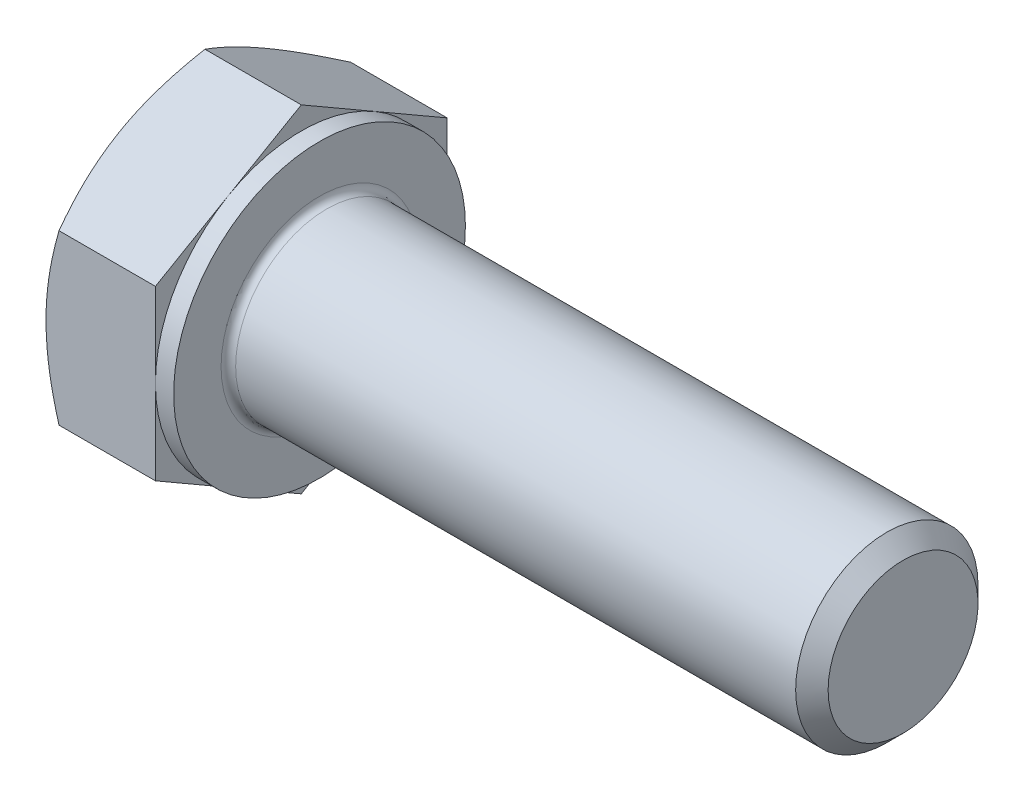
ISO-10303-21;
HEADER;
FILE_DESCRIPTION(('STEP AP214'),'2;1');
FILE_NAME('part.step','',(''),(''),'','','');
FILE_SCHEMA(('AUTOMOTIVE_DESIGN { 1 0 10303 214 1 1 1 1 }'));
ENDSEC;
DATA;
#1=APPLICATION_CONTEXT('core data for automotive mechanical design processes');
#2=APPLICATION_PROTOCOL_DEFINITION('international standard','automotive_design',2000,#1);
#3=PRODUCT_CONTEXT('',#1,'mechanical');
#4=PRODUCT('Part','Part','',(#3));
#5=PRODUCT_RELATED_PRODUCT_CATEGORY('part','',(#4));
#6=PRODUCT_DEFINITION_FORMATION('','',#4);
#7=PRODUCT_DEFINITION_CONTEXT('part definition',#1,'design');
#8=PRODUCT_DEFINITION('design','',#6,#7);
#9=PRODUCT_DEFINITION_SHAPE('','',#8);
#10=(LENGTH_UNIT() NAMED_UNIT(*) SI_UNIT(.MILLI.,.METRE.));
#11=(NAMED_UNIT(*) PLANE_ANGLE_UNIT() SI_UNIT($,.RADIAN.));
#12=(NAMED_UNIT(*) SI_UNIT($,.STERADIAN.) SOLID_ANGLE_UNIT());
#13=UNCERTAINTY_MEASURE_WITH_UNIT(LENGTH_MEASURE(1.E-05),#10,'distance_accuracy_value','');
#14=(GEOMETRIC_REPRESENTATION_CONTEXT(3) GLOBAL_UNCERTAINTY_ASSIGNED_CONTEXT((#13)) GLOBAL_UNIT_ASSIGNED_CONTEXT((#10,
#11,#12)) REPRESENTATION_CONTEXT('',''));
#15=CARTESIAN_POINT('',(0.,0.,0.));
#16=DIRECTION('',(0.,0.,1.));
#17=DIRECTION('',(1.,0.,0.));
#18=AXIS2_PLACEMENT_3D('',#15,#16,#17);
#19=CARTESIAN_POINT('',(-29.5,14.9999999999999,0.));
#20=DIRECTION('',(1.,0.,0.));
#21=DIRECTION('',(0.,0.,-1.));
#22=AXIS2_PLACEMENT_3D('',#19,#20,#21);
#23=CONICAL_SURFACE('',#22,4.,1.0471975511966);
#24=CARTESIAN_POINT('',(-29.1426677409252,10.3810823764291,-0.000200000000000053));
#25=CARTESIAN_POINT('',(-29.2012821263517,10.4825685161861,0.175579150323228));
#26=CARTESIAN_POINT('',(-29.2545896785377,10.5849306785594,0.352875616326381));
#27=CARTESIAN_POINT('',(-29.3476383292536,10.7914274945225,0.710538593175706));
#28=CARTESIAN_POINT('',(-29.3873465109703,10.8955658171435,0.890911458970151));
#29=CARTESIAN_POINT('',(-29.4491577847197,11.1025518698424,1.24942181870279));
#30=CARTESIAN_POINT('',(-29.4716722684771,11.2053677534493,1.42750415293514));
#31=CARTESIAN_POINT('',(-29.4985493768534,11.4114832800097,1.78450671716651));
#32=CARTESIAN_POINT('',(-29.5029342585731,11.5147821738388,1.9634256496441));
#33=CARTESIAN_POINT('',(-29.49380992706,11.7078002949537,2.29774284219673));
#34=CARTESIAN_POINT('',(-29.482541046012,11.7975484230751,2.45319115998706));
#35=CARTESIAN_POINT('',(-29.4468260092018,11.976459973645,2.76307505563505));
#36=CARTESIAN_POINT('',(-29.4223676542885,12.0656227773192,2.91750956174413));
#37=CARTESIAN_POINT('',(-29.3612239350807,12.2449031798764,3.22803232777458));
#38=CARTESIAN_POINT('',(-29.3242793963451,12.3349980891057,3.3840812880631));
#39=CARTESIAN_POINT('',(-29.240429927452,12.5138441979999,3.69385183540384));
#40=CARTESIAN_POINT('',(-29.1935446977873,12.6025976887741,3.84757739077378));
#41=CARTESIAN_POINT('',(-29.1426677409252,12.6907143932953,4.0002));
#42=B_SPLINE_CURVE_WITH_KNOTS('',3,(#24,#25,#26,#27,#28,#29,#30,#31,#32,#33,#34,#35,#36,#37,#38,
#39,#40,#41),.UNSPECIFIED.,.F.,.F.,(4,2,2,2,2,2,2,2,4),(0.,0.634047835695967,1.26961969224543,
1.88946157213122,2.50854226669297,3.04757825393386,3.58711366126904,4.13861653143764,
4.68903648037744),.UNSPECIFIED.);
#43=CARTESIAN_POINT('',(-29.1427344100918,10.3811978464829,0.));
#44=VERTEX_POINT('',#43);
#45=CARTESIAN_POINT('',(-29.5,11.5358983848622,2.00000000000001));
#46=VERTEX_POINT('',#45);
#47=EDGE_CURVE('E107',#44,#46,#42,.T.);
#48=ORIENTED_EDGE('',*,*,#47,.T.);
#49=CARTESIAN_POINT('',(-29.5,14.9999999999999,0.));
#50=DIRECTION('',(1.,0.,0.));
#51=DIRECTION('',(0.,0.,-1.));
#52=AXIS2_PLACEMENT_3D('',#49,#50,#51);
#53=CIRCLE('',#52,4.);
#54=CARTESIAN_POINT('',(-29.5,11.5358983848622,-2.));
#55=VERTEX_POINT('',#54);
#56=EDGE_CURVE('E109',#46,#55,#53,.T.);
#57=ORIENTED_EDGE('',*,*,#56,.T.);
#58=CARTESIAN_POINT('',(-29.1426677409252,12.6907143932953,-4.0002));
#59=CARTESIAN_POINT('',(-29.2012821263517,12.5892282535382,-3.82442084967677));
#60=CARTESIAN_POINT('',(-29.2545896785377,12.4868660911649,-3.64712438367362));
#61=CARTESIAN_POINT('',(-29.3476383292536,12.2803692752018,-3.28946140682429));
#62=CARTESIAN_POINT('',(-29.3873465109703,12.1762309525809,-3.10908854102985));
#63=CARTESIAN_POINT('',(-29.4491577847197,11.969244899882,-2.75057818129721));
#64=CARTESIAN_POINT('',(-29.4716722684771,11.866429016275,-2.57249584706486));
#65=CARTESIAN_POINT('',(-29.4985493768534,11.6603134897146,-2.21549328283349));
#66=CARTESIAN_POINT('',(-29.502934258573,11.5570145958856,-2.0365743503559));
#67=CARTESIAN_POINT('',(-29.49380992706,11.3639964747706,-1.70225715780327));
#68=CARTESIAN_POINT('',(-29.482541046012,11.2742483466493,-1.54680884001293));
#69=CARTESIAN_POINT('',(-29.4468260092018,11.0953367960794,-1.23692494436494));
#70=CARTESIAN_POINT('',(-29.4223676542885,11.0061739924051,-1.08249043825587));
#71=CARTESIAN_POINT('',(-29.3612239350807,10.826893589848,-0.771967672225421));
#72=CARTESIAN_POINT('',(-29.3242793963451,10.7367986806186,-0.615918711936897));
#73=CARTESIAN_POINT('',(-29.240429927452,10.5579525717244,-0.30614816459616));
#74=CARTESIAN_POINT('',(-29.1935446977873,10.4691990809503,-0.15242260922622));
#75=CARTESIAN_POINT('',(-29.1426677409252,10.3810823764291,0.000200000000000096));
#76=B_SPLINE_CURVE_WITH_KNOTS('',3,(#58,#59,#60,#61,#62,#63,#64,#65,#66,#67,#68,#69,#70,#71,#72,
#73,#74,#75),.UNSPECIFIED.,.F.,.F.,(4,2,2,2,2,2,2,2,4),(0.,0.634047835695967,1.26961969224543,
1.88946157213122,2.50854226669297,3.04757825393386,3.58711366126903,4.13861653143764,
4.68903648037743),.UNSPECIFIED.);
#77=EDGE_CURVE('E111',#55,#44,#76,.T.);
#78=ORIENTED_EDGE('',*,*,#77,.T.);
#79=EDGE_LOOP('',(#48,#57,#78));
#80=FACE_BOUND('',#79,.T.);
#81=ADVANCED_FACE('F16',(#80),#23,.T.);
#82=CARTESIAN_POINT('',(-26.,10.3811978464829,0.));
#83=DIRECTION('',(0.,0.866025403784437,-0.500000000000002));
#84=DIRECTION('',(0.,0.500000000000002,0.866025403784438));
#85=AXIS2_PLACEMENT_3D('',#82,#83,#84);
#86=PLANE('',#85);
#87=DIRECTION('',(0.,-0.500000000000002,-0.866025403784438));
#88=VECTOR('',#87,1.);
#89=CARTESIAN_POINT('',(-26.5,10.3811978464829,0.));
#90=LINE('',#89,#88);
#91=CARTESIAN_POINT('',(-26.5,12.6905989232414,4.));
#92=VERTEX_POINT('',#91);
#93=CARTESIAN_POINT('',(-26.5,11.5358983848622,2.00000000000001));
#94=VERTEX_POINT('',#93);
#95=EDGE_CURVE('E343',#92,#94,#90,.T.);
#96=ORIENTED_EDGE('',*,*,#95,.F.);
#97=DIRECTION('',(-1.,0.,0.));
#98=VECTOR('',#97,1.);
#99=CARTESIAN_POINT('',(-26.,12.6905989232414,4.));
#100=LINE('',#99,#98);
#101=CARTESIAN_POINT('',(-29.1427344100918,12.6905989232414,4.));
#102=VERTEX_POINT('',#101);
#103=EDGE_CURVE('E130',#92,#102,#100,.T.);
#104=ORIENTED_EDGE('',*,*,#103,.T.);
#105=EDGE_CURVE('E116',#46,#102,#42,.T.);
#106=ORIENTED_EDGE('',*,*,#105,.F.);
#107=ORIENTED_EDGE('',*,*,#47,.F.);
#108=DIRECTION('',(-1.,0.,0.));
#109=VECTOR('',#108,1.);
#110=CARTESIAN_POINT('',(-26.,10.3811978464829,0.));
#111=LINE('',#110,#109);
#112=CARTESIAN_POINT('',(-26.5,10.3811978464829,0.));
#113=VERTEX_POINT('',#112);
#114=EDGE_CURVE('E134',#113,#44,#111,.T.);
#115=ORIENTED_EDGE('',*,*,#114,.F.);
#116=EDGE_CURVE('E318',#94,#113,#90,.T.);
#117=ORIENTED_EDGE('',*,*,#116,.F.);
#118=EDGE_LOOP('',(#96,#104,#106,#107,#115,#117));
#119=FACE_BOUND('',#118,.T.);
#120=ADVANCED_FACE('F128',(#119),#86,.F.);
#121=CARTESIAN_POINT('',(-26.5,18.9999999999999,0.));
#122=DIRECTION('',(1.,0.,0.));
#123=DIRECTION('',(0.,0.,-1.));
#124=AXIS2_PLACEMENT_3D('',#121,#122,#123);
#125=PLANE('',#124);
#126=DIRECTION('',(0.,-1.,0.));
#127=VECTOR('',#126,1.);
#128=CARTESIAN_POINT('',(-26.5,17.3094010767584,4.));
#129=LINE('',#128,#127);
#130=CARTESIAN_POINT('',(-26.5,14.9999999999999,4.));
#131=VERTEX_POINT('',#130);
#132=EDGE_CURVE('E341',#131,#92,#129,.T.);
#133=ORIENTED_EDGE('',*,*,#132,.T.);
#134=ORIENTED_EDGE('',*,*,#95,.T.);
#135=CARTESIAN_POINT('',(-26.5,14.9999999999999,0.));
#136=DIRECTION('',(-1.,0.,0.));
#137=DIRECTION('',(0.,0.,1.));
#138=AXIS2_PLACEMENT_3D('',#135,#136,#137);
#139=CIRCLE('',#138,4.);
#140=EDGE_CURVE('E185',#94,#131,#139,.T.);
#141=ORIENTED_EDGE('',*,*,#140,.T.);
#142=EDGE_LOOP('',(#133,#134,#141));
#143=FACE_BOUND('',#142,.T.);
#144=ADVANCED_FACE('F248',(#143),#125,.T.);
#145=CARTESIAN_POINT('',(-26.,17.3094010767584,4.));
#146=DIRECTION('',(0.,0.,-1.));
#147=DIRECTION('',(0.,1.,0.));
#148=AXIS2_PLACEMENT_3D('',#145,#146,#147);
#149=PLANE('',#148);
#150=CARTESIAN_POINT('',(-26.5,17.3094010767584,4.));
#151=VERTEX_POINT('',#150);
#152=EDGE_CURVE('E340',#151,#131,#129,.T.);
#153=ORIENTED_EDGE('',*,*,#152,.F.);
#154=DIRECTION('',(-1.,0.,0.));
#155=VECTOR('',#154,1.);
#156=CARTESIAN_POINT('',(-26.,17.3094010767584,4.));
#157=LINE('',#156,#155);
#158=CARTESIAN_POINT('',(-29.1427344100918,17.3094010767584,4.));
#159=VERTEX_POINT('',#158);
#160=EDGE_CURVE('E339',#151,#159,#157,.T.);
#161=ORIENTED_EDGE('',*,*,#160,.T.);
#162=CARTESIAN_POINT('',(-27.4998887961495,8.69796157658811,4.));
#163=CARTESIAN_POINT('',(-27.5854530369729,8.87354153497209,4.));
#164=CARTESIAN_POINT('',(-27.6702248430965,9.04951414561178,4.));
#165=CARTESIAN_POINT('',(-27.837739723387,9.40245315858413,4.));
#166=CARTESIAN_POINT('',(-27.9204824959664,9.57941970390419,4.));
#167=CARTESIAN_POINT('',(-28.0838907382949,9.93542014962346,4.));
#168=CARTESIAN_POINT('',(-28.1645432739468,10.1144600067295,4.));
#169=CARTESIAN_POINT('',(-28.3226764203452,10.4739298696836,4.));
#170=CARTESIAN_POINT('',(-28.400157174723,10.6543598121421,4.));
#171=CARTESIAN_POINT('',(-28.5536716825981,11.0230428778165,4.));
#172=CARTESIAN_POINT('',(-28.6295672963304,11.2113538254883,4.));
#173=CARTESIAN_POINT('',(-28.7758497847195,11.5901420119287,4.));
#174=CARTESIAN_POINT('',(-28.8462360553385,11.780619485618,4.));
#175=CARTESIAN_POINT('',(-28.9797243769526,12.1637182300872,4.));
#176=CARTESIAN_POINT('',(-29.0428403490089,12.3563346025639,4.));
#177=CARTESIAN_POINT('',(-29.1598284826928,12.7443286575659,4.));
#178=CARTESIAN_POINT('',(-29.2137034525482,12.9397054816194,4.));
#179=CARTESIAN_POINT('',(-29.3094039202655,13.3322498044961,4.));
#180=CARTESIAN_POINT('',(-29.3512969444863,13.5294005391197,4.));
#181=CARTESIAN_POINT('',(-29.4207298053613,13.9262536760577,4.));
#182=CARTESIAN_POINT('',(-29.4482712073208,14.1259557976617,4.));
#183=CARTESIAN_POINT('',(-29.4864482629274,14.5242663068987,4.));
#184=CARTESIAN_POINT('',(-29.4973089342517,14.7228525804078,4.));
#185=CARTESIAN_POINT('',(-29.5018027718821,15.12024143528,4.));
#186=CARTESIAN_POINT('',(-29.4954356907423,15.3190440197091,4.));
#187=CARTESIAN_POINT('',(-29.4706800159784,15.6536491305111,4.));
#188=CARTESIAN_POINT('',(-29.4566512306317,15.7897962038773,4.));
#189=CARTESIAN_POINT('',(-29.4213349416854,16.061151796549,4.));
#190=CARTESIAN_POINT('',(-29.4000465350652,16.1963601969574,4.));
#191=CARTESIAN_POINT('',(-29.3264048874112,16.6003610867596,4.));
#192=CARTESIAN_POINT('',(-29.2642863908954,16.8673965799238,4.));
#193=CARTESIAN_POINT('',(-29.1558120932894,17.2669084207604,4.));
#194=CARTESIAN_POINT('',(-29.1165655166621,17.4014334823697,4.));
#195=CARTESIAN_POINT('',(-29.0338088985023,17.6691784914413,4.));
#196=CARTESIAN_POINT('',(-28.9902988239799,17.8023984287961,4.));
#197=CARTESIAN_POINT('',(-28.8997289068467,18.0675733901942,4.));
#198=CARTESIAN_POINT('',(-28.8526700574738,18.1995287566003,4.));
#199=CARTESIAN_POINT('',(-28.7555749048121,18.4623323384186,4.));
#200=CARTESIAN_POINT('',(-28.7055386705795,18.5931805794286,4.));
#201=CARTESIAN_POINT('',(-28.5666442616633,18.9462730200095,4.));
#202=CARTESIAN_POINT('',(-28.4754012405551,19.1675782346863,4.));
#203=CARTESIAN_POINT('',(-28.2875277167214,19.6078984954444,4.));
#204=CARTESIAN_POINT('',(-28.1908966079767,19.826913280609,4.));
#205=CARTESIAN_POINT('',(-27.9935297345821,20.2631725015547,4.));
#206=CARTESIAN_POINT('',(-27.8927925316548,20.4804162844557,4.));
#207=CARTESIAN_POINT('',(-27.6881887153415,20.9134283158316,4.));
#208=CARTESIAN_POINT('',(-27.5843220049164,21.1291965182972,4.));
#209=CARTESIAN_POINT('',(-27.3739823112541,21.5598802172623,4.));
#210=CARTESIAN_POINT('',(-27.2675054560151,21.7747938188175,4.));
#211=CARTESIAN_POINT('',(-27.0526079641295,22.2036480285313,4.));
#212=CARTESIAN_POINT('',(-26.9441873066838,22.4175886262479,4.));
#213=CARTESIAN_POINT('',(-26.6166549654437,23.0581260332037,4.));
#214=CARTESIAN_POINT('',(-26.3952245067659,23.4835366030032,4.));
#215=CARTESIAN_POINT('',(-25.9720105066474,24.2870483021661,4.));
#216=CARTESIAN_POINT('',(-25.7706420495133,24.6653691275771,4.));
#217=CARTESIAN_POINT('',(-25.365481408379,25.4207405569165,4.));
#218=CARTESIAN_POINT('',(-25.1616890732912,25.7977910797636,4.));
#219=CARTESIAN_POINT('',(-24.7530047448409,26.5496417866801,4.));
#220=CARTESIAN_POINT('',(-24.5481188077559,26.9244452679584,4.));
#221=CARTESIAN_POINT('',(-24.1369734047691,27.6732594596549,4.));
#222=CARTESIAN_POINT('',(-23.9307140499049,28.0472702310148,4.));
#223=CARTESIAN_POINT('',(-23.7239549669649,28.4210028084017,4.));
#224=B_SPLINE_CURVE_WITH_KNOTS('',3,(#162,#163,#164,#165,#166,#167,#168,#169,#170,#171,#172,
#173,#174,#175,#176,#177,#178,#179,#180,#181,#182,#183,#184,#185,#186,#187,#188,#189,#190,#191,
#192,#193,#194,#195,#196,#197,#198,#199,#200,#201,#202,#203,#204,#205,#206,#207,#208,#209,#210,
#211,#212,#213,#214,#215,#216,#217,#218,#219,#220,#221,#222,#223),.UNSPECIFIED.,.F.,.F.,(4,2,2,
2,2,2,2,2,2,2,2,2,2,2,2,2,2,2,2,2,2,2,2,2,2,2,2,2,2,2,4),(0.,0.58596407958923,1.1720147329867,
1.76109183439221,2.35014223039207,2.95916537113302,3.56825519120251,4.17615863495934,
4.78387701573011,5.38809978568041,5.99225664035712,6.58818972380394,7.1841313668092,
7.59453802315343,8.00499574839966,8.82630883348706,9.24666973074844,9.66703388092334,
10.0872808123363,10.5075180005348,11.2255416622244,11.9436462463738,12.6620045660407,
13.3803851833438,14.0999050636407,14.8194326474842,16.2581595478086,17.5438734370163,
18.8296678929703,20.1111105384062,21.3924508103747),.UNSPECIFIED.);
#225=CARTESIAN_POINT('',(-29.5,14.9999999999999,4.));
#226=VERTEX_POINT('',#225);
#227=EDGE_CURVE('E223',#226,#159,#224,.T.);
#228=ORIENTED_EDGE('',*,*,#227,.F.);
#229=EDGE_CURVE('E136',#102,#226,#224,.T.);
#230=ORIENTED_EDGE('',*,*,#229,.F.);
#231=ORIENTED_EDGE('',*,*,#103,.F.);
#232=ORIENTED_EDGE('',*,*,#132,.F.);
#233=EDGE_LOOP('',(#153,#161,#228,#230,#231,#232));
#234=FACE_BOUND('',#233,.T.);
#235=ADVANCED_FACE('F245',(#234),#149,.F.);
#236=DIRECTION('',(0.,-0.500000000000001,0.866025403784438));
#237=VECTOR('',#236,1.);
#238=CARTESIAN_POINT('',(-26.5,19.6188021535169,0.));
#239=LINE('',#238,#237);
#240=CARTESIAN_POINT('',(-26.5,18.4641016151377,2.));
#241=VERTEX_POINT('',#240);
#242=EDGE_CURVE('E335',#241,#151,#239,.T.);
#243=ORIENTED_EDGE('',*,*,#242,.T.);
#244=ORIENTED_EDGE('',*,*,#152,.T.);
#245=EDGE_CURVE('E316',#131,#241,#139,.T.);
#246=ORIENTED_EDGE('',*,*,#245,.T.);
#247=EDGE_LOOP('',(#243,#244,#246));
#248=FACE_BOUND('',#247,.T.);
#249=ADVANCED_FACE('F243',(#248),#125,.T.);
#250=CARTESIAN_POINT('',(-26.,19.6188021535169,0.));
#251=DIRECTION('',(0.,-0.866025403784438,-0.500000000000001));
#252=DIRECTION('',(0.,0.500000000000001,-0.866025403784438));
#253=AXIS2_PLACEMENT_3D('',#250,#251,#252);
#254=PLANE('',#253);
#255=CARTESIAN_POINT('',(-26.5,19.6188021535169,0.));
#256=VERTEX_POINT('',#255);
#257=EDGE_CURVE('E334',#256,#241,#239,.T.);
#258=ORIENTED_EDGE('',*,*,#257,.F.);
#259=DIRECTION('',(-1.,0.,0.));
#260=VECTOR('',#259,1.);
#261=CARTESIAN_POINT('',(-26.,19.6188021535169,0.));
#262=LINE('',#261,#260);
#263=CARTESIAN_POINT('',(-29.1427344100918,19.6188021535169,0.));
#264=VERTEX_POINT('',#263);
#265=EDGE_CURVE('E237',#256,#264,#262,.T.);
#266=ORIENTED_EDGE('',*,*,#265,.T.);
#267=CARTESIAN_POINT('',(-29.1426677409252,17.3092856067046,4.0002));
#268=CARTESIAN_POINT('',(-29.2012821263517,17.4107717464616,3.82442084967677));
#269=CARTESIAN_POINT('',(-29.2545896785377,17.5131339088349,3.64712438367362));
#270=CARTESIAN_POINT('',(-29.3476383292536,17.719630724798,3.28946140682429));
#271=CARTESIAN_POINT('',(-29.3873465109703,17.823769047419,3.10908854102985));
#272=CARTESIAN_POINT('',(-29.4491577847197,18.0307551001179,2.75057818129721));
#273=CARTESIAN_POINT('',(-29.4716722684771,18.1335709837248,2.57249584706486));
#274=CARTESIAN_POINT('',(-29.4985493768534,18.3396865102852,2.21549328283349));
#275=CARTESIAN_POINT('',(-29.5029342585731,18.4429854041143,2.0365743503559));
#276=CARTESIAN_POINT('',(-29.49380992706,18.6360035252293,1.70225715780327));
#277=CARTESIAN_POINT('',(-29.482541046012,18.7257516533506,1.54680884001294));
#278=CARTESIAN_POINT('',(-29.4468260092018,18.9046632039205,1.23692494436495));
#279=CARTESIAN_POINT('',(-29.4223676542885,18.9938260075947,1.08249043825587));
#280=CARTESIAN_POINT('',(-29.3612239350807,19.1731064101519,0.771967672225423));
#281=CARTESIAN_POINT('',(-29.3242793963451,19.2632013193812,0.615918711936898));
#282=CARTESIAN_POINT('',(-29.240429927452,19.4420474282754,0.30614816459616));
#283=CARTESIAN_POINT('',(-29.1935446977873,19.5308009190496,0.15242260922622));
#284=CARTESIAN_POINT('',(-29.1426677409252,19.6189176235708,-0.000200000000000094));
#285=B_SPLINE_CURVE_WITH_KNOTS('',3,(#267,#268,#269,#270,#271,#272,#273,#274,#275,#276,#277,
#278,#279,#280,#281,#282,#283,#284),.UNSPECIFIED.,.F.,.F.,(4,2,2,2,2,2,2,2,4),(0.,
0.634047835695966,1.26961969224543,1.88946157213122,2.50854226669297,3.04757825393385,
3.58711366126903,4.13861653143764,4.68903648037743),.UNSPECIFIED.);
#286=CARTESIAN_POINT('',(-29.5,18.4641016151377,2.));
#287=VERTEX_POINT('',#286);
#288=EDGE_CURVE('E231',#287,#264,#285,.T.);
#289=ORIENTED_EDGE('',*,*,#288,.F.);
#290=EDGE_CURVE('E236',#159,#287,#285,.T.);
#291=ORIENTED_EDGE('',*,*,#290,.F.);
#292=ORIENTED_EDGE('',*,*,#160,.F.);
#293=ORIENTED_EDGE('',*,*,#242,.F.);
#294=EDGE_LOOP('',(#258,#266,#289,#291,#292,#293));
#295=FACE_BOUND('',#294,.T.);
#296=ADVANCED_FACE('F239',(#295),#254,.F.);
#297=DIRECTION('',(0.,0.500000000000001,0.866025403784438));
#298=VECTOR('',#297,1.);
#299=CARTESIAN_POINT('',(-26.5,17.3094010767584,-4.));
#300=LINE('',#299,#298);
#301=CARTESIAN_POINT('',(-26.5,18.4641016151377,-2.));
#302=VERTEX_POINT('',#301);
#303=EDGE_CURVE('E238',#302,#256,#300,.T.);
#304=ORIENTED_EDGE('',*,*,#303,.T.);
#305=ORIENTED_EDGE('',*,*,#257,.T.);
#306=EDGE_CURVE('E311',#241,#302,#139,.T.);
#307=ORIENTED_EDGE('',*,*,#306,.T.);
#308=EDGE_LOOP('',(#304,#305,#307));
#309=FACE_BOUND('',#308,.T.);
#310=ADVANCED_FACE('F242',(#309),#125,.T.);
#311=CARTESIAN_POINT('',(-26.,17.3094010767584,-4.));
#312=DIRECTION('',(0.,-0.866025403784438,0.500000000000001));
#313=DIRECTION('',(0.,-0.500000000000001,-0.866025403784438));
#314=AXIS2_PLACEMENT_3D('',#311,#312,#313);
#315=PLANE('',#314);
#316=CARTESIAN_POINT('',(-26.5,17.3094010767584,-4.));
#317=VERTEX_POINT('',#316);
#318=EDGE_CURVE('E315',#317,#302,#300,.T.);
#319=ORIENTED_EDGE('',*,*,#318,.F.);
#320=DIRECTION('',(-1.,0.,0.));
#321=VECTOR('',#320,1.);
#322=CARTESIAN_POINT('',(-26.,17.3094010767584,-4.));
#323=LINE('',#322,#321);
#324=CARTESIAN_POINT('',(-29.1427344100918,17.3094010767584,-4.));
#325=VERTEX_POINT('',#324);
#326=EDGE_CURVE('E196',#317,#325,#323,.T.);
#327=ORIENTED_EDGE('',*,*,#326,.T.);
#328=CARTESIAN_POINT('',(-29.1426677409252,19.6189176235708,0.0002));
#329=CARTESIAN_POINT('',(-29.2012821263517,19.5174314838137,-0.175579150323228));
#330=CARTESIAN_POINT('',(-29.2545896785377,19.4150693214404,-0.35287561632638));
#331=CARTESIAN_POINT('',(-29.3476383292536,19.2085725054773,-0.710538593175705));
#332=CARTESIAN_POINT('',(-29.3873465109703,19.1044341828564,-0.890911458970149));
#333=CARTESIAN_POINT('',(-29.4491577847197,18.8974481301575,-1.24942181870279));
#334=CARTESIAN_POINT('',(-29.4716722684771,18.7946322465505,-1.42750415293514));
#335=CARTESIAN_POINT('',(-29.4985493768534,18.5885167199902,-1.78450671716651));
#336=CARTESIAN_POINT('',(-29.5029342585731,18.4852178261611,-1.9634256496441));
#337=CARTESIAN_POINT('',(-29.49380992706,18.2921997050461,-2.29774284219673));
#338=CARTESIAN_POINT('',(-29.482541046012,18.2024515769248,-2.45319115998706));
#339=CARTESIAN_POINT('',(-29.4468260092018,18.0235400263549,-2.76307505563505));
#340=CARTESIAN_POINT('',(-29.4223676542885,17.9343772226806,-2.91750956174413));
#341=CARTESIAN_POINT('',(-29.3612239350807,17.7550968201235,-3.22803232777458));
#342=CARTESIAN_POINT('',(-29.3242793963451,17.6650019108941,-3.3840812880631));
#343=CARTESIAN_POINT('',(-29.240429927452,17.4861558019999,-3.69385183540384));
#344=CARTESIAN_POINT('',(-29.1935446977873,17.3974023112258,-3.84757739077378));
#345=CARTESIAN_POINT('',(-29.1426677409252,17.3092856067046,-4.0002));
#346=B_SPLINE_CURVE_WITH_KNOTS('',3,(#328,#329,#330,#331,#332,#333,#334,#335,#336,#337,#338,
#339,#340,#341,#342,#343,#344,#345),.UNSPECIFIED.,.F.,.F.,(4,2,2,2,2,2,2,2,4),(0.,
0.634047835695967,1.26961969224543,1.88946157213122,2.50854226669297,3.04757825393386,
3.58711366126904,4.13861653143764,4.68903648037744),.UNSPECIFIED.);
#347=CARTESIAN_POINT('',(-29.5,18.4641016151377,-2.));
#348=VERTEX_POINT('',#347);
#349=EDGE_CURVE('E189',#348,#325,#346,.T.);
#350=ORIENTED_EDGE('',*,*,#349,.F.);
#351=EDGE_CURVE('E195',#264,#348,#346,.T.);
#352=ORIENTED_EDGE('',*,*,#351,.F.);
#353=ORIENTED_EDGE('',*,*,#265,.F.);
#354=ORIENTED_EDGE('',*,*,#303,.F.);
#355=EDGE_LOOP('',(#319,#327,#350,#352,#353,#354));
#356=FACE_BOUND('',#355,.T.);
#357=ADVANCED_FACE('F198',(#356),#315,.F.);
#358=ORIENTED_EDGE('',*,*,#318,.T.);
#359=CARTESIAN_POINT('',(-26.5,14.9999999999999,-4.));
#360=VERTEX_POINT('',#359);
#361=EDGE_CURVE('E188',#302,#360,#139,.T.);
#362=ORIENTED_EDGE('',*,*,#361,.T.);
#363=DIRECTION('',(0.,1.,0.));
#364=VECTOR('',#363,1.);
#365=CARTESIAN_POINT('',(-26.5,17.3094010767584,-4.));
#366=LINE('',#365,#364);
#367=EDGE_CURVE('E158',#360,#317,#366,.T.);
#368=ORIENTED_EDGE('',*,*,#367,.T.);
#369=EDGE_LOOP('',(#358,#362,#368));
#370=FACE_BOUND('',#369,.T.);
#371=ADVANCED_FACE('F298',(#370),#125,.T.);
#372=CARTESIAN_POINT('',(-29.5,14.9999999999999,0.));
#373=DIRECTION('',(-1.,0.,0.));
#374=DIRECTION('',(0.,0.,1.));
#375=AXIS2_PLACEMENT_3D('',#372,#373,#374);
#376=CYLINDRICAL_SURFACE('',#375,4.);
#377=ORIENTED_EDGE('',*,*,#361,.F.);
#378=ORIENTED_EDGE('',*,*,#306,.F.);
#379=ORIENTED_EDGE('',*,*,#245,.F.);
#380=ORIENTED_EDGE('',*,*,#140,.F.);
#381=CARTESIAN_POINT('',(-26.5,11.5358983848622,-2.));
#382=VERTEX_POINT('',#381);
#383=EDGE_CURVE('E183',#382,#94,#139,.T.);
#384=ORIENTED_EDGE('',*,*,#383,.F.);
#385=EDGE_CURVE('E180',#360,#382,#139,.T.);
#386=ORIENTED_EDGE('',*,*,#385,.F.);
#387=EDGE_LOOP('',(#377,#378,#379,#380,#384,#386));
#388=FACE_BOUND('',#387,.T.);
#389=CARTESIAN_POINT('',(-26.,14.9999999999999,0.));
#390=DIRECTION('',(1.,0.,0.));
#391=DIRECTION('',(0.,0.,-1.));
#392=AXIS2_PLACEMENT_3D('',#389,#390,#391);
#393=CIRCLE('',#392,4.);
#394=CARTESIAN_POINT('',(-26.,14.9999999999999,-4.));
#395=VERTEX_POINT('',#394);
#396=EDGE_CURVE('E174',#395,#395,#393,.T.);
#397=ORIENTED_EDGE('',*,*,#396,.F.);
#398=EDGE_LOOP('',(#397));
#399=FACE_BOUND('',#398,.T.);
#400=ADVANCED_FACE('F296',(#388,#399),#376,.T.);
#401=ORIENTED_EDGE('',*,*,#116,.T.);
#402=DIRECTION('',(0.,0.5,-0.866025403784439));
#403=VECTOR('',#402,1.);
#404=CARTESIAN_POINT('',(-26.5,12.6905989232414,-4.));
#405=LINE('',#404,#403);
#406=EDGE_CURVE('E167',#113,#382,#405,.T.);
#407=ORIENTED_EDGE('',*,*,#406,.T.);
#408=ORIENTED_EDGE('',*,*,#383,.T.);
#409=EDGE_LOOP('',(#401,#407,#408));
#410=FACE_BOUND('',#409,.T.);
#411=ADVANCED_FACE('F260',(#410),#125,.T.);
#412=CARTESIAN_POINT('',(-26.,12.6905989232414,-4.));
#413=DIRECTION('',(0.,0.866025403784439,0.5));
#414=DIRECTION('',(0.,-0.5,0.866025403784439));
#415=AXIS2_PLACEMENT_3D('',#412,#413,#414);
#416=PLANE('',#415);
#417=ORIENTED_EDGE('',*,*,#406,.F.);
#418=ORIENTED_EDGE('',*,*,#114,.T.);
#419=ORIENTED_EDGE('',*,*,#77,.F.);
#420=CARTESIAN_POINT('',(-29.142734410092,12.6905989232412,-4.));
#421=VERTEX_POINT('',#420);
#422=EDGE_CURVE('E171',#421,#55,#76,.T.);
#423=ORIENTED_EDGE('',*,*,#422,.F.);
#424=DIRECTION('',(-1.,0.,0.));
#425=VECTOR('',#424,1.);
#426=CARTESIAN_POINT('',(-26.,12.6905989232414,-4.));
#427=LINE('',#426,#425);
#428=CARTESIAN_POINT('',(-26.5,12.6905989232414,-4.));
#429=VERTEX_POINT('',#428);
#430=EDGE_CURVE('E39',#429,#421,#427,.T.);
#431=ORIENTED_EDGE('',*,*,#430,.F.);
#432=EDGE_CURVE('E165',#382,#429,#405,.T.);
#433=ORIENTED_EDGE('',*,*,#432,.F.);
#434=EDGE_LOOP('',(#417,#418,#419,#423,#431,#433));
#435=FACE_BOUND('',#434,.T.);
#436=ADVANCED_FACE('F293',(#435),#416,.F.);
#437=ORIENTED_EDGE('',*,*,#422,.T.);
#438=CARTESIAN_POINT('',(-29.5,14.9999999999999,-4.));
#439=VERTEX_POINT('',#438);
#440=EDGE_CURVE('E31',#55,#439,#53,.T.);
#441=ORIENTED_EDGE('',*,*,#440,.T.);
#442=CARTESIAN_POINT('',(-27.4998887961495,8.6979615765881,-4.));
#443=CARTESIAN_POINT('',(-27.5854530369729,8.87354153497207,-4.));
#444=CARTESIAN_POINT('',(-27.6702248430965,9.04951414561176,-4.));
#445=CARTESIAN_POINT('',(-27.837739723387,9.40245315858411,-4.));
#446=CARTESIAN_POINT('',(-27.9204824959664,9.57941970390418,-4.));
#447=CARTESIAN_POINT('',(-28.0838907382949,9.93542014962344,-4.));
#448=CARTESIAN_POINT('',(-28.1645432739468,10.1144600067295,-4.));
#449=CARTESIAN_POINT('',(-28.3226764203452,10.4739298696835,-4.));
#450=CARTESIAN_POINT('',(-28.400157174723,10.6543598121421,-4.));
#451=CARTESIAN_POINT('',(-28.5536716825981,11.0230428778165,-4.));
#452=CARTESIAN_POINT('',(-28.6295672963304,11.2113538254883,-4.));
#453=CARTESIAN_POINT('',(-28.7758497847195,11.5901420119287,-4.));
#454=CARTESIAN_POINT('',(-28.8462360553384,11.780619485618,-4.));
#455=CARTESIAN_POINT('',(-28.9797243769526,12.1637182300872,-4.));
#456=CARTESIAN_POINT('',(-29.0428403490089,12.3563346025639,-4.));
#457=CARTESIAN_POINT('',(-29.1598284826928,12.7443286575659,-4.));
#458=CARTESIAN_POINT('',(-29.2137034525482,12.9397054816194,-4.));
#459=CARTESIAN_POINT('',(-29.3094039202655,13.3322498044961,-4.));
#460=CARTESIAN_POINT('',(-29.3512969444863,13.5294005391197,-4.));
#461=CARTESIAN_POINT('',(-29.4207298053613,13.9262536760577,-4.));
#462=CARTESIAN_POINT('',(-29.4482712073208,14.1259557976617,-4.));
#463=CARTESIAN_POINT('',(-29.4864482629274,14.5242663068986,-4.));
#464=CARTESIAN_POINT('',(-29.4973089342517,14.7228525804077,-4.));
#465=CARTESIAN_POINT('',(-29.5018027718821,15.12024143528,-4.));
#466=CARTESIAN_POINT('',(-29.4954356907423,15.3190440197091,-4.));
#467=CARTESIAN_POINT('',(-29.4706800159784,15.6536491305111,-4.));
#468=CARTESIAN_POINT('',(-29.4566512306317,15.7897962038773,-4.));
#469=CARTESIAN_POINT('',(-29.4213349416854,16.0611517965489,-4.));
#470=CARTESIAN_POINT('',(-29.4000465350652,16.1963601969574,-4.));
#471=CARTESIAN_POINT('',(-29.3264048874112,16.6003610867596,-4.));
#472=CARTESIAN_POINT('',(-29.2642863908954,16.8673965799238,-4.));
#473=CARTESIAN_POINT('',(-29.1558120932894,17.2669084207604,-4.));
#474=CARTESIAN_POINT('',(-29.1165655166621,17.4014334823697,-4.));
#475=CARTESIAN_POINT('',(-29.0338088985023,17.6691784914413,-4.));
#476=CARTESIAN_POINT('',(-28.9902988239799,17.8023984287961,-4.));
#477=CARTESIAN_POINT('',(-28.8997289068467,18.0675733901942,-4.));
#478=CARTESIAN_POINT('',(-28.8526700574738,18.1995287566003,-4.));
#479=CARTESIAN_POINT('',(-28.7555749048121,18.4623323384186,-4.));
#480=CARTESIAN_POINT('',(-28.7055386705795,18.5931805794286,-4.));
#481=CARTESIAN_POINT('',(-28.5666442616633,18.9462730200094,-4.));
#482=CARTESIAN_POINT('',(-28.4754012405551,19.1675782346863,-4.));
#483=CARTESIAN_POINT('',(-28.2875277167214,19.6078984954444,-4.));
#484=CARTESIAN_POINT('',(-28.1908966079767,19.8269132806089,-4.));
#485=CARTESIAN_POINT('',(-27.9935297345821,20.2631725015547,-4.));
#486=CARTESIAN_POINT('',(-27.8927925316548,20.4804162844556,-4.));
#487=CARTESIAN_POINT('',(-27.6881887153415,20.9134283158316,-4.));
#488=CARTESIAN_POINT('',(-27.5843220049164,21.1291965182972,-4.));
#489=CARTESIAN_POINT('',(-27.3739823112541,21.5598802172623,-4.));
#490=CARTESIAN_POINT('',(-27.2675054560151,21.7747938188175,-4.));
#491=CARTESIAN_POINT('',(-27.0526079641295,22.2036480285313,-4.));
#492=CARTESIAN_POINT('',(-26.9441873066839,22.4175886262479,-4.));
#493=CARTESIAN_POINT('',(-26.6166549654437,23.0581260332037,-4.));
#494=CARTESIAN_POINT('',(-26.3952245067659,23.4835366030032,-4.));
#495=CARTESIAN_POINT('',(-25.9720105066474,24.2870483021661,-4.));
#496=CARTESIAN_POINT('',(-25.7706420495133,24.665369127577,-4.));
#497=CARTESIAN_POINT('',(-25.365481408379,25.4207405569165,-4.));
#498=CARTESIAN_POINT('',(-25.1616890732912,25.7977910797636,-4.));
#499=CARTESIAN_POINT('',(-24.7530047448409,26.5496417866801,-4.));
#500=CARTESIAN_POINT('',(-24.5481188077559,26.9244452679584,-4.));
#501=CARTESIAN_POINT('',(-24.1369734047691,27.6732594596549,-4.));
#502=CARTESIAN_POINT('',(-23.9307140499049,28.0472702310148,-4.));
#503=CARTESIAN_POINT('',(-23.7239549669649,28.4210028084017,-4.));
#504=B_SPLINE_CURVE_WITH_KNOTS('',3,(#442,#443,#444,#445,#446,#447,#448,#449,#450,#451,#452,
#453,#454,#455,#456,#457,#458,#459,#460,#461,#462,#463,#464,#465,#466,#467,#468,#469,#470,#471,
#472,#473,#474,#475,#476,#477,#478,#479,#480,#481,#482,#483,#484,#485,#486,#487,#488,#489,#490,
#491,#492,#493,#494,#495,#496,#497,#498,#499,#500,#501,#502,#503),.UNSPECIFIED.,.F.,.F.,(4,2,2,
2,2,2,2,2,2,2,2,2,2,2,2,2,2,2,2,2,2,2,2,2,2,2,2,2,2,2,4),(0.,0.585964079589232,1.1720147329867,
1.76109183439221,2.35014223039207,2.95916537113302,3.56825519120251,4.17615863495934,
4.78387701573012,5.38809978568042,5.99225664035712,6.58818972380395,7.1841313668092,
7.59453802315344,8.00499574839967,8.82630883348707,9.24666973074844,9.66703388092333,
10.0872808123363,10.5075180005348,11.2255416622244,11.9436462463738,12.6620045660407,
13.3803851833438,14.0999050636407,14.8194326474842,16.2581595478086,17.5438734370163,
18.8296678929704,20.1111105384062,21.3924508103747),.UNSPECIFIED.);
#505=EDGE_CURVE('E141',#439,#421,#504,.F.);
#506=ORIENTED_EDGE('',*,*,#505,.T.);
#507=EDGE_LOOP('',(#437,#441,#506));
#508=FACE_BOUND('',#507,.T.);
#509=ADVANCED_FACE('F206',(#508),#23,.T.);
#510=CARTESIAN_POINT('',(-29.5,19.6188021535169,0.));
#511=DIRECTION('',(1.,0.,0.));
#512=DIRECTION('',(0.,0.,-1.));
#513=AXIS2_PLACEMENT_3D('',#510,#511,#512);
#514=PLANE('',#513);
#515=EDGE_CURVE('E138',#439,#348,#53,.T.);
#516=ORIENTED_EDGE('',*,*,#515,.F.);
#517=ORIENTED_EDGE('',*,*,#440,.F.);
#518=ORIENTED_EDGE('',*,*,#56,.F.);
#519=EDGE_CURVE('E123',#226,#46,#53,.T.);
#520=ORIENTED_EDGE('',*,*,#519,.F.);
#521=CARTESIAN_POINT('',(-29.5,14.9999999999999,0.));
#522=DIRECTION('',(-1.,0.,0.));
#523=DIRECTION('',(0.,0.,1.));
#524=AXIS2_PLACEMENT_3D('',#521,#522,#523);
#525=CIRCLE('',#524,4.);
#526=EDGE_CURVE('E137',#226,#287,#525,.T.);
#527=ORIENTED_EDGE('',*,*,#526,.T.);
#528=EDGE_CURVE('E126',#348,#287,#53,.T.);
#529=ORIENTED_EDGE('',*,*,#528,.F.);
#530=EDGE_LOOP('',(#516,#517,#518,#520,#527,#529));
#531=FACE_BOUND('',#530,.T.);
#532=ADVANCED_FACE('F120',(#531),#514,.F.);
#533=ORIENTED_EDGE('',*,*,#349,.T.);
#534=EDGE_CURVE('E144',#325,#439,#504,.F.);
#535=ORIENTED_EDGE('',*,*,#534,.T.);
#536=ORIENTED_EDGE('',*,*,#515,.T.);
#537=EDGE_LOOP('',(#533,#535,#536));
#538=FACE_BOUND('',#537,.T.);
#539=ADVANCED_FACE('F290',(#538),#23,.T.);
#540=CARTESIAN_POINT('',(-26.,17.3094010767584,-4.));
#541=DIRECTION('',(0.,0.,1.));
#542=DIRECTION('',(1.,0.,0.));
#543=AXIS2_PLACEMENT_3D('',#540,#541,#542);
#544=PLANE('',#543);
#545=EDGE_CURVE('E150',#429,#360,#366,.T.);
#546=ORIENTED_EDGE('',*,*,#545,.F.);
#547=ORIENTED_EDGE('',*,*,#430,.T.);
#548=ORIENTED_EDGE('',*,*,#505,.F.);
#549=ORIENTED_EDGE('',*,*,#534,.F.);
#550=ORIENTED_EDGE('',*,*,#326,.F.);
#551=ORIENTED_EDGE('',*,*,#367,.F.);
#552=EDGE_LOOP('',(#546,#547,#548,#549,#550,#551));
#553=FACE_BOUND('',#552,.T.);
#554=ADVANCED_FACE('F259',(#553),#544,.F.);
#555=ORIENTED_EDGE('',*,*,#432,.T.);
#556=ORIENTED_EDGE('',*,*,#545,.T.);
#557=ORIENTED_EDGE('',*,*,#385,.T.);
#558=EDGE_LOOP('',(#555,#556,#557));
#559=FACE_BOUND('',#558,.T.);
#560=ADVANCED_FACE('F252',(#559),#125,.T.);
#561=ORIENTED_EDGE('',*,*,#229,.T.);
#562=ORIENTED_EDGE('',*,*,#519,.T.);
#563=ORIENTED_EDGE('',*,*,#105,.T.);
#564=EDGE_LOOP('',(#561,#562,#563));
#565=FACE_BOUND('',#564,.T.);
#566=ADVANCED_FACE('F135',(#565),#23,.T.);
#567=ORIENTED_EDGE('',*,*,#227,.T.);
#568=ORIENTED_EDGE('',*,*,#290,.T.);
#569=ORIENTED_EDGE('',*,*,#526,.F.);
#570=EDGE_LOOP('',(#567,#568,#569));
#571=FACE_BOUND('',#570,.T.);
#572=ADVANCED_FACE('F330',(#571),#23,.T.);
#573=ORIENTED_EDGE('',*,*,#288,.T.);
#574=ORIENTED_EDGE('',*,*,#351,.T.);
#575=ORIENTED_EDGE('',*,*,#528,.T.);
#576=EDGE_LOOP('',(#573,#574,#575));
#577=FACE_BOUND('',#576,.T.);
#578=ADVANCED_FACE('F205',(#577),#23,.T.);
#579=CARTESIAN_POINT('',(-26.,19.6188021535169,0.));
#580=DIRECTION('',(1.,0.,0.));
#581=DIRECTION('',(0.,0.,-1.));
#582=AXIS2_PLACEMENT_3D('',#579,#580,#581);
#583=PLANE('',#582);
#584=CARTESIAN_POINT('',(-26.,14.9999999999999,0.));
#585=DIRECTION('',(1.,0.,0.));
#586=DIRECTION('',(0.,0.,-1.));
#587=AXIS2_PLACEMENT_3D('',#584,#585,#586);
#588=CIRCLE('',#587,2.7);
#589=CARTESIAN_POINT('',(-26.,14.9999999999999,-2.7));
#590=VERTEX_POINT('',#589);
#591=EDGE_CURVE('E156',#590,#590,#588,.F.);
#592=ORIENTED_EDGE('',*,*,#591,.T.);
#593=EDGE_LOOP('',(#592));
#594=FACE_BOUND('',#593,.T.);
#595=ORIENTED_EDGE('',*,*,#396,.T.);
#596=EDGE_LOOP('',(#595));
#597=FACE_BOUND('',#596,.T.);
#598=ADVANCED_FACE('F283',(#594,#597),#583,.T.);
#599=CARTESIAN_POINT('',(-25.8,14.9999999999999,0.));
#600=DIRECTION('',(1.,0.,0.));
#601=DIRECTION('',(0.,0.,-1.));
#602=AXIS2_PLACEMENT_3D('',#599,#600,#601);
#603=TOROIDAL_SURFACE('',#602,2.7,0.2);
#604=CARTESIAN_POINT('',(-25.8,14.9999999999999,0.));
#605=DIRECTION('',(1.,0.,0.));
#606=DIRECTION('',(0.,0.,-1.));
#607=AXIS2_PLACEMENT_3D('',#604,#605,#606);
#608=CIRCLE('',#607,2.5);
#609=CARTESIAN_POINT('',(-25.8,14.9999999999999,-2.5));
#610=VERTEX_POINT('',#609);
#611=EDGE_CURVE('E532',#610,#610,#608,.T.);
#612=ORIENTED_EDGE('',*,*,#611,.F.);
#613=EDGE_LOOP('',(#612));
#614=FACE_BOUND('',#613,.T.);
#615=ORIENTED_EDGE('',*,*,#591,.F.);
#616=EDGE_LOOP('',(#615));
#617=FACE_BOUND('',#616,.T.);
#618=ADVANCED_FACE('F276',(#614,#617),#603,.F.);
#619=CARTESIAN_POINT('',(-29.5,14.9999999999999,0.));
#620=DIRECTION('',(-1.,0.,0.));
#621=DIRECTION('',(0.,0.,1.));
#622=AXIS2_PLACEMENT_3D('',#619,#620,#621);
#623=CYLINDRICAL_SURFACE('',#622,2.5);
#624=ORIENTED_EDGE('',*,*,#611,.T.);
#625=EDGE_LOOP('',(#624));
#626=FACE_BOUND('',#625,.T.);
#627=CARTESIAN_POINT('',(-10.445,14.9999999999999,0.));
#628=DIRECTION('',(-1.,0.,0.));
#629=DIRECTION('',(0.,0.,1.));
#630=AXIS2_PLACEMENT_3D('',#627,#628,#629);
#631=CIRCLE('',#630,2.5);
#632=CARTESIAN_POINT('',(-10.445,14.9999999999999,2.5));
#633=VERTEX_POINT('',#632);
#634=EDGE_CURVE('E24',#633,#633,#631,.T.);
#635=ORIENTED_EDGE('',*,*,#634,.T.);
#636=EDGE_LOOP('',(#635));
#637=FACE_BOUND('',#636,.T.);
#638=ADVANCED_FACE('F269',(#626,#637),#623,.T.);
#639=CARTESIAN_POINT('',(-10.,14.9999999999999,0.));
#640=DIRECTION('',(-1.,0.,0.));
#641=DIRECTION('',(0.,0.,1.));
#642=AXIS2_PLACEMENT_3D('',#639,#640,#641);
#643=CONICAL_SURFACE('',#642,2.055,0.78539816339744);
#644=ORIENTED_EDGE('',*,*,#634,.F.);
#645=EDGE_LOOP('',(#644));
#646=FACE_BOUND('',#645,.T.);
#647=CARTESIAN_POINT('',(-10.,14.9999999999999,0.));
#648=DIRECTION('',(-1.,0.,0.));
#649=DIRECTION('',(0.,0.,1.));
#650=AXIS2_PLACEMENT_3D('',#647,#648,#649);
#651=CIRCLE('',#650,2.055);
#652=CARTESIAN_POINT('',(-10.,14.9999999999999,2.055));
#653=VERTEX_POINT('',#652);
#654=EDGE_CURVE('E11',#653,#653,#651,.T.);
#655=ORIENTED_EDGE('',*,*,#654,.T.);
#656=EDGE_LOOP('',(#655));
#657=FACE_BOUND('',#656,.T.);
#658=ADVANCED_FACE('F264',(#646,#657),#643,.T.);
#659=CARTESIAN_POINT('',(-10.,14.9999999999999,0.));
#660=DIRECTION('',(-1.,0.,0.));
#661=DIRECTION('',(0.,0.,1.));
#662=AXIS2_PLACEMENT_3D('',#659,#660,#661);
#663=PLANE('',#662);
#664=ORIENTED_EDGE('',*,*,#654,.F.);
#665=EDGE_LOOP('',(#664));
#666=FACE_BOUND('',#665,.T.);
#667=ADVANCED_FACE('F18',(#666),#663,.F.);
#668=CLOSED_SHELL('',(#81,#120,#144,#235,#249,#296,#310,#357,#371,#400,#411,#436,#509,#532,#539,
#554,#560,#566,#572,#578,#598,#618,#638,#658,#667));
#669=MANIFOLD_SOLID_BREP('B1',#668);
#670=ADVANCED_BREP_SHAPE_REPRESENTATION('',(#18,#669),#14);
#671=SHAPE_DEFINITION_REPRESENTATION(#9,#670);
ENDSEC;
END-ISO-10303-21;
